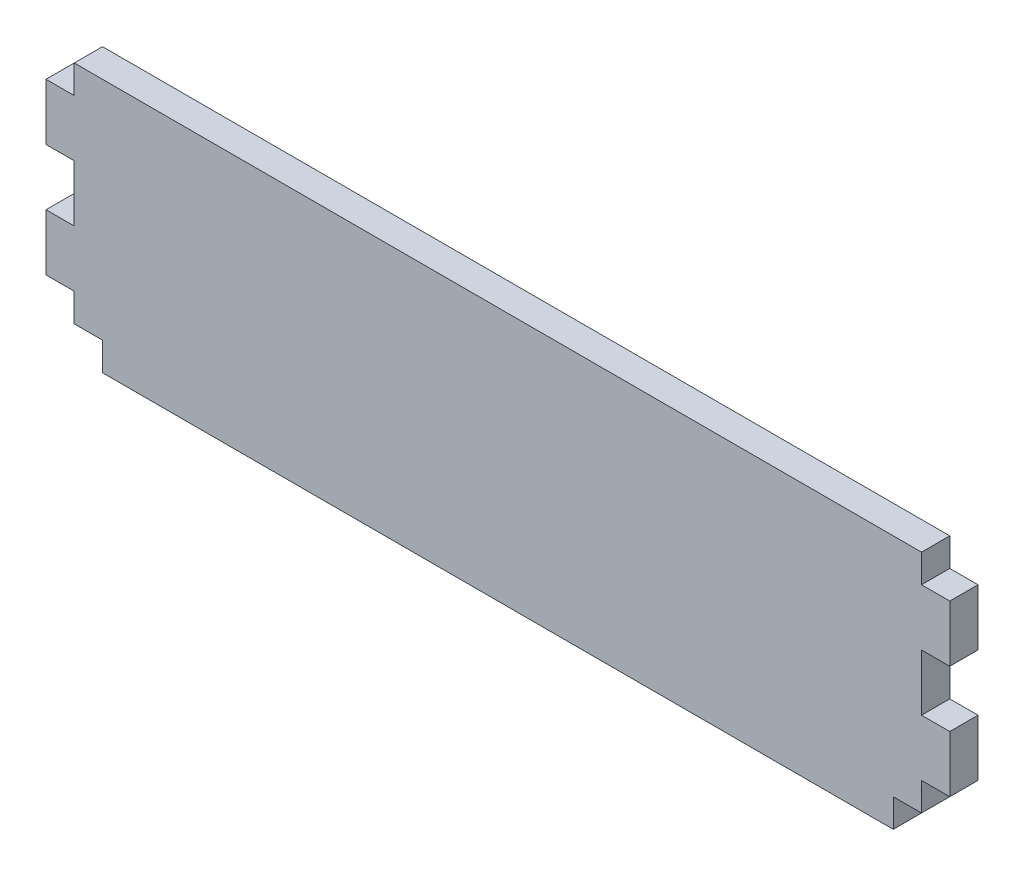
ISO-10303-21;
HEADER;
FILE_DESCRIPTION(('STEP AP214'),'2;1');
FILE_NAME('part.step','',(''),(''),'','','');
FILE_SCHEMA(('AUTOMOTIVE_DESIGN { 1 0 10303 214 1 1 1 1 }'));
ENDSEC;
DATA;
#1=APPLICATION_CONTEXT('core data for automotive mechanical design processes');
#2=APPLICATION_PROTOCOL_DEFINITION('international standard','automotive_design',2000,#1);
#3=PRODUCT_CONTEXT('',#1,'mechanical');
#4=PRODUCT('Part','Part','',(#3));
#5=PRODUCT_RELATED_PRODUCT_CATEGORY('part','',(#4));
#6=PRODUCT_DEFINITION_FORMATION('','',#4);
#7=PRODUCT_DEFINITION_CONTEXT('part definition',#1,'design');
#8=PRODUCT_DEFINITION('design','',#6,#7);
#9=PRODUCT_DEFINITION_SHAPE('','',#8);
#10=(LENGTH_UNIT() NAMED_UNIT(*) SI_UNIT(.MILLI.,.METRE.));
#11=(NAMED_UNIT(*) PLANE_ANGLE_UNIT() SI_UNIT($,.RADIAN.));
#12=(NAMED_UNIT(*) SI_UNIT($,.STERADIAN.) SOLID_ANGLE_UNIT());
#13=UNCERTAINTY_MEASURE_WITH_UNIT(LENGTH_MEASURE(1.E-05),#10,'distance_accuracy_value','');
#14=(GEOMETRIC_REPRESENTATION_CONTEXT(3) GLOBAL_UNCERTAINTY_ASSIGNED_CONTEXT((#13)) GLOBAL_UNIT_ASSIGNED_CONTEXT((#10,
#11,#12)) REPRESENTATION_CONTEXT('',''));
#15=CARTESIAN_POINT('',(0.,0.,0.));
#16=DIRECTION('',(0.,0.,1.));
#17=DIRECTION('',(1.,0.,0.));
#18=AXIS2_PLACEMENT_3D('',#15,#16,#17);
#19=CARTESIAN_POINT('',(85.5050137289704,-69.2237442922374,5.));
#20=DIRECTION('',(0.,1.,0.));
#21=DIRECTION('',(0.,0.,1.));
#22=AXIS2_PLACEMENT_3D('',#19,#20,#21);
#23=PLANE('',#22);
#24=DIRECTION('',(0.,0.,1.));
#25=VECTOR('',#24,1.);
#26=CARTESIAN_POINT('',(80.5050137289704,-69.2237442922374,0.));
#27=LINE('',#26,#25);
#28=CARTESIAN_POINT('',(80.5050137289704,-69.2237442922374,0.));
#29=VERTEX_POINT('',#28);
#30=CARTESIAN_POINT('',(80.5050137289704,-69.2237442922374,5.));
#31=VERTEX_POINT('',#30);
#32=EDGE_CURVE('E452',#29,#31,#27,.T.);
#33=ORIENTED_EDGE('',*,*,#32,.F.);
#34=DIRECTION('',(1.,0.,0.));
#35=VECTOR('',#34,1.);
#36=CARTESIAN_POINT('',(85.5050137289704,-69.2237442922374,0.));
#37=LINE('',#36,#35);
#38=CARTESIAN_POINT('',(85.5050137289704,-69.2237442922374,0.));
#39=VERTEX_POINT('',#38);
#40=EDGE_CURVE('E237',#29,#39,#37,.T.);
#41=ORIENTED_EDGE('',*,*,#40,.T.);
#42=DIRECTION('',(0.,0.,-1.));
#43=VECTOR('',#42,1.);
#44=CARTESIAN_POINT('',(85.5050137289704,-69.2237442922374,5.));
#45=LINE('',#44,#43);
#46=CARTESIAN_POINT('',(85.5050137289704,-69.2237442922374,5.));
#47=VERTEX_POINT('',#46);
#48=EDGE_CURVE('E11',#47,#39,#45,.T.);
#49=ORIENTED_EDGE('',*,*,#48,.F.);
#50=DIRECTION('',(1.,0.,0.));
#51=VECTOR('',#50,1.);
#52=CARTESIAN_POINT('',(85.5050137289704,-69.2237442922374,5.));
#53=LINE('',#52,#51);
#54=EDGE_CURVE('E147',#31,#47,#53,.T.);
#55=ORIENTED_EDGE('',*,*,#54,.F.);
#56=EDGE_LOOP('',(#33,#41,#49,#55));
#57=FACE_BOUND('',#56,.T.);
#58=ADVANCED_FACE('F45',(#57),#23,.F.);
#59=CARTESIAN_POINT('',(-64.4949862710296,-69.2237442922374,0.));
#60=VERTEX_POINT('',#59);
#61=CARTESIAN_POINT('',(-59.4949862710296,-69.2237442922374,0.));
#62=VERTEX_POINT('',#61);
#63=EDGE_CURVE('E232',#60,#62,#37,.T.);
#64=ORIENTED_EDGE('',*,*,#63,.T.);
#65=DIRECTION('',(0.,0.,1.));
#66=VECTOR('',#65,1.);
#67=CARTESIAN_POINT('',(-59.4949862710296,-69.2237442922374,0.));
#68=LINE('',#67,#66);
#69=CARTESIAN_POINT('',(-59.4949862710296,-69.2237442922374,5.));
#70=VERTEX_POINT('',#69);
#71=EDGE_CURVE('E435',#62,#70,#68,.T.);
#72=ORIENTED_EDGE('',*,*,#71,.T.);
#73=CARTESIAN_POINT('',(-64.4949862710296,-69.2237442922374,5.));
#74=VERTEX_POINT('',#73);
#75=EDGE_CURVE('E434',#74,#70,#53,.T.);
#76=ORIENTED_EDGE('',*,*,#75,.F.);
#77=DIRECTION('',(0.,0.,-1.));
#78=VECTOR('',#77,1.);
#79=CARTESIAN_POINT('',(-64.4949862710296,-69.2237442922374,5.));
#80=LINE('',#79,#78);
#81=EDGE_CURVE('E228',#74,#60,#80,.T.);
#82=ORIENTED_EDGE('',*,*,#81,.T.);
#83=EDGE_LOOP('',(#64,#72,#76,#82));
#84=FACE_BOUND('',#83,.T.);
#85=ADVANCED_FACE('F47',(#84),#23,.F.);
#86=CARTESIAN_POINT('',(85.5050137289704,-64.2237442922374,5.));
#87=DIRECTION('',(-1.,0.,0.));
#88=DIRECTION('',(0.,0.,1.));
#89=AXIS2_PLACEMENT_3D('',#86,#87,#88);
#90=PLANE('',#89);
#91=DIRECTION('',(0.,1.,0.));
#92=VECTOR('',#91,1.);
#93=CARTESIAN_POINT('',(85.5050137289704,-64.2237442922374,0.));
#94=LINE('',#93,#92);
#95=CARTESIAN_POINT('',(85.5050137289704,-64.2237442922374,0.));
#96=VERTEX_POINT('',#95);
#97=EDGE_CURVE('E236',#39,#96,#94,.T.);
#98=ORIENTED_EDGE('',*,*,#97,.T.);
#99=DIRECTION('',(0.,0.,-1.));
#100=VECTOR('',#99,1.);
#101=CARTESIAN_POINT('',(85.5050137289704,-64.2237442922374,5.));
#102=LINE('',#101,#100);
#103=CARTESIAN_POINT('',(85.5050137289704,-64.2237442922374,5.));
#104=VERTEX_POINT('',#103);
#105=EDGE_CURVE('E54',#104,#96,#102,.T.);
#106=ORIENTED_EDGE('',*,*,#105,.F.);
#107=DIRECTION('',(0.,1.,0.));
#108=VECTOR('',#107,1.);
#109=CARTESIAN_POINT('',(85.5050137289704,-64.2237442922374,5.));
#110=LINE('',#109,#108);
#111=EDGE_CURVE('E437',#47,#104,#110,.T.);
#112=ORIENTED_EDGE('',*,*,#111,.F.);
#113=ORIENTED_EDGE('',*,*,#48,.T.);
#114=EDGE_LOOP('',(#98,#106,#112,#113));
#115=FACE_BOUND('',#114,.T.);
#116=ADVANCED_FACE('F447',(#115),#90,.F.);
#117=CARTESIAN_POINT('',(90.5050137289704,-64.2237442922374,5.));
#118=DIRECTION('',(0.,1.,0.));
#119=DIRECTION('',(0.,0.,1.));
#120=AXIS2_PLACEMENT_3D('',#117,#118,#119);
#121=PLANE('',#120);
#122=DIRECTION('',(1.,0.,0.));
#123=VECTOR('',#122,1.);
#124=CARTESIAN_POINT('',(90.5050137289704,-64.2237442922374,0.));
#125=LINE('',#124,#123);
#126=CARTESIAN_POINT('',(90.5050137289704,-64.2237442922374,0.));
#127=VERTEX_POINT('',#126);
#128=EDGE_CURVE('E240',#96,#127,#125,.T.);
#129=ORIENTED_EDGE('',*,*,#128,.T.);
#130=DIRECTION('',(0.,0.,-1.));
#131=VECTOR('',#130,1.);
#132=CARTESIAN_POINT('',(90.5050137289704,-64.2237442922374,5.));
#133=LINE('',#132,#131);
#134=CARTESIAN_POINT('',(90.5050137289704,-64.2237442922374,5.));
#135=VERTEX_POINT('',#134);
#136=EDGE_CURVE('E350',#135,#127,#133,.T.);
#137=ORIENTED_EDGE('',*,*,#136,.F.);
#138=DIRECTION('',(1.,0.,0.));
#139=VECTOR('',#138,1.);
#140=CARTESIAN_POINT('',(90.5050137289704,-64.2237442922374,5.));
#141=LINE('',#140,#139);
#142=EDGE_CURVE('E361',#104,#135,#141,.T.);
#143=ORIENTED_EDGE('',*,*,#142,.F.);
#144=ORIENTED_EDGE('',*,*,#105,.T.);
#145=EDGE_LOOP('',(#129,#137,#143,#144));
#146=FACE_BOUND('',#145,.T.);
#147=ADVANCED_FACE('F359',(#146),#121,.F.);
#148=CARTESIAN_POINT('',(90.5050137289704,-54.2237442922374,5.));
#149=DIRECTION('',(-1.,0.,0.));
#150=DIRECTION('',(0.,0.,1.));
#151=AXIS2_PLACEMENT_3D('',#148,#149,#150);
#152=PLANE('',#151);
#153=DIRECTION('',(0.,1.,0.));
#154=VECTOR('',#153,1.);
#155=CARTESIAN_POINT('',(90.5050137289704,-54.2237442922374,0.));
#156=LINE('',#155,#154);
#157=CARTESIAN_POINT('',(90.5050137289704,-54.2237442922374,0.));
#158=VERTEX_POINT('',#157);
#159=EDGE_CURVE('E243',#127,#158,#156,.T.);
#160=ORIENTED_EDGE('',*,*,#159,.T.);
#161=DIRECTION('',(0.,0.,-1.));
#162=VECTOR('',#161,1.);
#163=CARTESIAN_POINT('',(90.5050137289704,-54.2237442922374,5.));
#164=LINE('',#163,#162);
#165=CARTESIAN_POINT('',(90.5050137289704,-54.2237442922374,5.));
#166=VERTEX_POINT('',#165);
#167=EDGE_CURVE('E346',#166,#158,#164,.T.);
#168=ORIENTED_EDGE('',*,*,#167,.F.);
#169=DIRECTION('',(0.,1.,0.));
#170=VECTOR('',#169,1.);
#171=CARTESIAN_POINT('',(90.5050137289704,-54.2237442922374,5.));
#172=LINE('',#171,#170);
#173=EDGE_CURVE('E383',#135,#166,#172,.T.);
#174=ORIENTED_EDGE('',*,*,#173,.F.);
#175=ORIENTED_EDGE('',*,*,#136,.T.);
#176=EDGE_LOOP('',(#160,#168,#174,#175));
#177=FACE_BOUND('',#176,.T.);
#178=ADVANCED_FACE('F373',(#177),#152,.F.);
#179=CARTESIAN_POINT('',(90.5050137289704,-54.2237442922374,5.));
#180=DIRECTION('',(0.,-1.,0.));
#181=DIRECTION('',(0.,0.,-1.));
#182=AXIS2_PLACEMENT_3D('',#179,#180,#181);
#183=PLANE('',#182);
#184=DIRECTION('',(-1.,0.,0.));
#185=VECTOR('',#184,1.);
#186=CARTESIAN_POINT('',(90.5050137289704,-54.2237442922374,0.));
#187=LINE('',#186,#185);
#188=CARTESIAN_POINT('',(85.5050137289704,-54.2237442922374,0.));
#189=VERTEX_POINT('',#188);
#190=EDGE_CURVE('E246',#158,#189,#187,.T.);
#191=ORIENTED_EDGE('',*,*,#190,.T.);
#192=DIRECTION('',(0.,0.,-1.));
#193=VECTOR('',#192,1.);
#194=CARTESIAN_POINT('',(85.5050137289704,-54.2237442922374,5.));
#195=LINE('',#194,#193);
#196=CARTESIAN_POINT('',(85.5050137289704,-54.2237442922374,5.));
#197=VERTEX_POINT('',#196);
#198=EDGE_CURVE('E342',#197,#189,#195,.T.);
#199=ORIENTED_EDGE('',*,*,#198,.F.);
#200=DIRECTION('',(-1.,0.,0.));
#201=VECTOR('',#200,1.);
#202=CARTESIAN_POINT('',(90.5050137289704,-54.2237442922374,5.));
#203=LINE('',#202,#201);
#204=EDGE_CURVE('E379',#166,#197,#203,.T.);
#205=ORIENTED_EDGE('',*,*,#204,.F.);
#206=ORIENTED_EDGE('',*,*,#167,.T.);
#207=EDGE_LOOP('',(#191,#199,#205,#206));
#208=FACE_BOUND('',#207,.T.);
#209=ADVANCED_FACE('F377',(#208),#183,.F.);
#210=CARTESIAN_POINT('',(85.5050137289704,-54.2237442922374,5.));
#211=DIRECTION('',(-1.,0.,0.));
#212=DIRECTION('',(0.,-1.,0.));
#213=AXIS2_PLACEMENT_3D('',#210,#211,#212);
#214=PLANE('',#213);
#215=DIRECTION('',(0.,1.,0.));
#216=VECTOR('',#215,1.);
#217=CARTESIAN_POINT('',(85.5050137289704,-54.2237442922374,0.));
#218=LINE('',#217,#216);
#219=CARTESIAN_POINT('',(85.5050137289704,-44.2237442922374,0.));
#220=VERTEX_POINT('',#219);
#221=EDGE_CURVE('E249',#189,#220,#218,.T.);
#222=ORIENTED_EDGE('',*,*,#221,.T.);
#223=DIRECTION('',(0.,0.,-1.));
#224=VECTOR('',#223,1.);
#225=CARTESIAN_POINT('',(85.5050137289704,-44.2237442922374,5.));
#226=LINE('',#225,#224);
#227=CARTESIAN_POINT('',(85.5050137289704,-44.2237442922374,5.));
#228=VERTEX_POINT('',#227);
#229=EDGE_CURVE('E338',#228,#220,#226,.T.);
#230=ORIENTED_EDGE('',*,*,#229,.F.);
#231=DIRECTION('',(0.,1.,0.));
#232=VECTOR('',#231,1.);
#233=CARTESIAN_POINT('',(85.5050137289704,-54.2237442922374,5.));
#234=LINE('',#233,#232);
#235=EDGE_CURVE('E382',#197,#228,#234,.T.);
#236=ORIENTED_EDGE('',*,*,#235,.F.);
#237=ORIENTED_EDGE('',*,*,#198,.T.);
#238=EDGE_LOOP('',(#222,#230,#236,#237));
#239=FACE_BOUND('',#238,.T.);
#240=ADVANCED_FACE('F529',(#239),#214,.F.);
#241=CARTESIAN_POINT('',(90.5050137289704,-44.2237442922374,5.));
#242=DIRECTION('',(0.,1.,0.));
#243=DIRECTION('',(0.,0.,1.));
#244=AXIS2_PLACEMENT_3D('',#241,#242,#243);
#245=PLANE('',#244);
#246=DIRECTION('',(1.,0.,0.));
#247=VECTOR('',#246,1.);
#248=CARTESIAN_POINT('',(90.5050137289704,-44.2237442922374,0.));
#249=LINE('',#248,#247);
#250=CARTESIAN_POINT('',(90.5050137289704,-44.2237442922374,0.));
#251=VERTEX_POINT('',#250);
#252=EDGE_CURVE('E252',#220,#251,#249,.T.);
#253=ORIENTED_EDGE('',*,*,#252,.T.);
#254=DIRECTION('',(0.,0.,-1.));
#255=VECTOR('',#254,1.);
#256=CARTESIAN_POINT('',(90.5050137289704,-44.2237442922374,5.));
#257=LINE('',#256,#255);
#258=CARTESIAN_POINT('',(90.5050137289704,-44.2237442922374,5.));
#259=VERTEX_POINT('',#258);
#260=EDGE_CURVE('E334',#259,#251,#257,.T.);
#261=ORIENTED_EDGE('',*,*,#260,.F.);
#262=DIRECTION('',(1.,0.,0.));
#263=VECTOR('',#262,1.);
#264=CARTESIAN_POINT('',(90.5050137289704,-44.2237442922374,5.));
#265=LINE('',#264,#263);
#266=EDGE_CURVE('E387',#228,#259,#265,.T.);
#267=ORIENTED_EDGE('',*,*,#266,.F.);
#268=ORIENTED_EDGE('',*,*,#229,.T.);
#269=EDGE_LOOP('',(#253,#261,#267,#268));
#270=FACE_BOUND('',#269,.T.);
#271=ADVANCED_FACE('F532',(#270),#245,.F.);
#272=CARTESIAN_POINT('',(90.5050137289704,-34.2237442922374,5.));
#273=DIRECTION('',(-1.,0.,0.));
#274=DIRECTION('',(0.,0.,1.));
#275=AXIS2_PLACEMENT_3D('',#272,#273,#274);
#276=PLANE('',#275);
#277=DIRECTION('',(0.,1.,0.));
#278=VECTOR('',#277,1.);
#279=CARTESIAN_POINT('',(90.5050137289704,-34.2237442922374,0.));
#280=LINE('',#279,#278);
#281=CARTESIAN_POINT('',(90.5050137289704,-34.2237442922374,0.));
#282=VERTEX_POINT('',#281);
#283=EDGE_CURVE('E255',#251,#282,#280,.T.);
#284=ORIENTED_EDGE('',*,*,#283,.T.);
#285=DIRECTION('',(0.,0.,-1.));
#286=VECTOR('',#285,1.);
#287=CARTESIAN_POINT('',(90.5050137289704,-34.2237442922374,5.));
#288=LINE('',#287,#286);
#289=CARTESIAN_POINT('',(90.5050137289704,-34.2237442922374,5.));
#290=VERTEX_POINT('',#289);
#291=EDGE_CURVE('E330',#290,#282,#288,.T.);
#292=ORIENTED_EDGE('',*,*,#291,.F.);
#293=DIRECTION('',(0.,1.,0.));
#294=VECTOR('',#293,1.);
#295=CARTESIAN_POINT('',(90.5050137289704,-34.2237442922374,5.));
#296=LINE('',#295,#294);
#297=EDGE_CURVE('E394',#259,#290,#296,.T.);
#298=ORIENTED_EDGE('',*,*,#297,.F.);
#299=ORIENTED_EDGE('',*,*,#260,.T.);
#300=EDGE_LOOP('',(#284,#292,#298,#299));
#301=FACE_BOUND('',#300,.T.);
#302=ADVANCED_FACE('F536',(#301),#276,.F.);
#303=CARTESIAN_POINT('',(90.5050137289704,-34.2237442922374,5.));
#304=DIRECTION('',(0.,-1.,0.));
#305=DIRECTION('',(0.,0.,-1.));
#306=AXIS2_PLACEMENT_3D('',#303,#304,#305);
#307=PLANE('',#306);
#308=DIRECTION('',(-1.,0.,0.));
#309=VECTOR('',#308,1.);
#310=CARTESIAN_POINT('',(90.5050137289704,-34.2237442922374,0.));
#311=LINE('',#310,#309);
#312=CARTESIAN_POINT('',(85.5050137289704,-34.2237442922374,0.));
#313=VERTEX_POINT('',#312);
#314=EDGE_CURVE('E258',#282,#313,#311,.T.);
#315=ORIENTED_EDGE('',*,*,#314,.T.);
#316=DIRECTION('',(0.,0.,-1.));
#317=VECTOR('',#316,1.);
#318=CARTESIAN_POINT('',(85.5050137289704,-34.2237442922374,5.));
#319=LINE('',#318,#317);
#320=CARTESIAN_POINT('',(85.5050137289704,-34.2237442922374,5.));
#321=VERTEX_POINT('',#320);
#322=EDGE_CURVE('E326',#321,#313,#319,.T.);
#323=ORIENTED_EDGE('',*,*,#322,.F.);
#324=DIRECTION('',(-1.,0.,0.));
#325=VECTOR('',#324,1.);
#326=CARTESIAN_POINT('',(90.5050137289704,-34.2237442922374,5.));
#327=LINE('',#326,#325);
#328=EDGE_CURVE('E397',#290,#321,#327,.T.);
#329=ORIENTED_EDGE('',*,*,#328,.F.);
#330=ORIENTED_EDGE('',*,*,#291,.T.);
#331=EDGE_LOOP('',(#315,#323,#329,#330));
#332=FACE_BOUND('',#331,.T.);
#333=ADVANCED_FACE('F540',(#332),#307,.F.);
#334=CARTESIAN_POINT('',(85.5050137289704,-34.2237442922374,5.));
#335=DIRECTION('',(-1.,0.,0.));
#336=DIRECTION('',(0.,-1.,0.));
#337=AXIS2_PLACEMENT_3D('',#334,#335,#336);
#338=PLANE('',#337);
#339=DIRECTION('',(0.,1.,0.));
#340=VECTOR('',#339,1.);
#341=CARTESIAN_POINT('',(85.5050137289704,-34.2237442922374,0.));
#342=LINE('',#341,#340);
#343=CARTESIAN_POINT('',(85.5050137289703,-29.2237442922375,0.));
#344=VERTEX_POINT('',#343);
#345=EDGE_CURVE('E261',#313,#344,#342,.T.);
#346=ORIENTED_EDGE('',*,*,#345,.T.);
#347=DIRECTION('',(0.,0.,-1.));
#348=VECTOR('',#347,1.);
#349=CARTESIAN_POINT('',(85.5050137289703,-29.2237442922375,5.));
#350=LINE('',#349,#348);
#351=CARTESIAN_POINT('',(85.5050137289703,-29.2237442922375,5.));
#352=VERTEX_POINT('',#351);
#353=EDGE_CURVE('E322',#352,#344,#350,.T.);
#354=ORIENTED_EDGE('',*,*,#353,.F.);
#355=DIRECTION('',(0.,1.,0.));
#356=VECTOR('',#355,1.);
#357=CARTESIAN_POINT('',(85.5050137289704,-34.2237442922374,5.));
#358=LINE('',#357,#356);
#359=EDGE_CURVE('E400',#321,#352,#358,.T.);
#360=ORIENTED_EDGE('',*,*,#359,.F.);
#361=ORIENTED_EDGE('',*,*,#322,.T.);
#362=EDGE_LOOP('',(#346,#354,#360,#361));
#363=FACE_BOUND('',#362,.T.);
#364=ADVANCED_FACE('F544',(#363),#338,.F.);
#365=CARTESIAN_POINT('',(-64.4949862710296,-29.2237442922375,5.));
#366=DIRECTION('',(0.,-1.,0.));
#367=DIRECTION('',(0.,0.,-1.));
#368=AXIS2_PLACEMENT_3D('',#365,#366,#367);
#369=PLANE('',#368);
#370=DIRECTION('',(-1.,0.,0.));
#371=VECTOR('',#370,1.);
#372=CARTESIAN_POINT('',(-64.4949862710296,-29.2237442922375,0.));
#373=LINE('',#372,#371);
#374=CARTESIAN_POINT('',(-64.4949862710296,-29.2237442922375,0.));
#375=VERTEX_POINT('',#374);
#376=EDGE_CURVE('E264',#344,#375,#373,.T.);
#377=ORIENTED_EDGE('',*,*,#376,.T.);
#378=DIRECTION('',(0.,0.,-1.));
#379=VECTOR('',#378,1.);
#380=CARTESIAN_POINT('',(-64.4949862710296,-29.2237442922375,5.));
#381=LINE('',#380,#379);
#382=CARTESIAN_POINT('',(-64.4949862710296,-29.2237442922375,5.));
#383=VERTEX_POINT('',#382);
#384=EDGE_CURVE('E318',#383,#375,#381,.T.);
#385=ORIENTED_EDGE('',*,*,#384,.F.);
#386=DIRECTION('',(-1.,0.,0.));
#387=VECTOR('',#386,1.);
#388=CARTESIAN_POINT('',(-64.4949862710296,-29.2237442922375,5.));
#389=LINE('',#388,#387);
#390=EDGE_CURVE('E403',#352,#383,#389,.T.);
#391=ORIENTED_EDGE('',*,*,#390,.F.);
#392=ORIENTED_EDGE('',*,*,#353,.T.);
#393=EDGE_LOOP('',(#377,#385,#391,#392));
#394=FACE_BOUND('',#393,.T.);
#395=ADVANCED_FACE('F548',(#394),#369,.F.);
#396=CARTESIAN_POINT('',(-64.4949862710296,-34.2237442922374,5.));
#397=DIRECTION('',(1.,0.,0.));
#398=DIRECTION('',(0.,0.,-1.));
#399=AXIS2_PLACEMENT_3D('',#396,#397,#398);
#400=PLANE('',#399);
#401=DIRECTION('',(0.,-1.,0.));
#402=VECTOR('',#401,1.);
#403=CARTESIAN_POINT('',(-64.4949862710296,-34.2237442922374,0.));
#404=LINE('',#403,#402);
#405=CARTESIAN_POINT('',(-64.4949862710296,-34.2237442922374,0.));
#406=VERTEX_POINT('',#405);
#407=EDGE_CURVE('E267',#375,#406,#404,.T.);
#408=ORIENTED_EDGE('',*,*,#407,.T.);
#409=DIRECTION('',(0.,0.,-1.));
#410=VECTOR('',#409,1.);
#411=CARTESIAN_POINT('',(-64.4949862710296,-34.2237442922374,5.));
#412=LINE('',#411,#410);
#413=CARTESIAN_POINT('',(-64.4949862710296,-34.2237442922374,5.));
#414=VERTEX_POINT('',#413);
#415=EDGE_CURVE('E314',#414,#406,#412,.T.);
#416=ORIENTED_EDGE('',*,*,#415,.F.);
#417=DIRECTION('',(0.,-1.,0.));
#418=VECTOR('',#417,1.);
#419=CARTESIAN_POINT('',(-64.4949862710296,-34.2237442922374,5.));
#420=LINE('',#419,#418);
#421=EDGE_CURVE('E406',#383,#414,#420,.T.);
#422=ORIENTED_EDGE('',*,*,#421,.F.);
#423=ORIENTED_EDGE('',*,*,#384,.T.);
#424=EDGE_LOOP('',(#408,#416,#422,#423));
#425=FACE_BOUND('',#424,.T.);
#426=ADVANCED_FACE('F552',(#425),#400,.F.);
#427=CARTESIAN_POINT('',(-69.4949862710296,-34.2237442922374,5.));
#428=DIRECTION('',(0.,-1.,0.));
#429=DIRECTION('',(0.,0.,-1.));
#430=AXIS2_PLACEMENT_3D('',#427,#428,#429);
#431=PLANE('',#430);
#432=DIRECTION('',(-1.,0.,0.));
#433=VECTOR('',#432,1.);
#434=CARTESIAN_POINT('',(-69.4949862710296,-34.2237442922374,0.));
#435=LINE('',#434,#433);
#436=CARTESIAN_POINT('',(-69.4949862710296,-34.2237442922374,0.));
#437=VERTEX_POINT('',#436);
#438=EDGE_CURVE('E270',#406,#437,#435,.T.);
#439=ORIENTED_EDGE('',*,*,#438,.T.);
#440=DIRECTION('',(0.,0.,-1.));
#441=VECTOR('',#440,1.);
#442=CARTESIAN_POINT('',(-69.4949862710296,-34.2237442922374,5.));
#443=LINE('',#442,#441);
#444=CARTESIAN_POINT('',(-69.4949862710296,-34.2237442922374,5.));
#445=VERTEX_POINT('',#444);
#446=EDGE_CURVE('E310',#445,#437,#443,.T.);
#447=ORIENTED_EDGE('',*,*,#446,.F.);
#448=DIRECTION('',(-1.,0.,0.));
#449=VECTOR('',#448,1.);
#450=CARTESIAN_POINT('',(-69.4949862710296,-34.2237442922374,5.));
#451=LINE('',#450,#449);
#452=EDGE_CURVE('E409',#414,#445,#451,.T.);
#453=ORIENTED_EDGE('',*,*,#452,.F.);
#454=ORIENTED_EDGE('',*,*,#415,.T.);
#455=EDGE_LOOP('',(#439,#447,#453,#454));
#456=FACE_BOUND('',#455,.T.);
#457=ADVANCED_FACE('F556',(#456),#431,.F.);
#458=CARTESIAN_POINT('',(-69.4949862710296,-34.2237442922374,5.));
#459=DIRECTION('',(1.,0.,0.));
#460=DIRECTION('',(0.,0.,-1.));
#461=AXIS2_PLACEMENT_3D('',#458,#459,#460);
#462=PLANE('',#461);
#463=DIRECTION('',(0.,-1.,0.));
#464=VECTOR('',#463,1.);
#465=CARTESIAN_POINT('',(-69.4949862710296,-34.2237442922374,0.));
#466=LINE('',#465,#464);
#467=CARTESIAN_POINT('',(-69.4949862710296,-44.2237442922374,0.));
#468=VERTEX_POINT('',#467);
#469=EDGE_CURVE('E273',#437,#468,#466,.T.);
#470=ORIENTED_EDGE('',*,*,#469,.T.);
#471=DIRECTION('',(0.,0.,-1.));
#472=VECTOR('',#471,1.);
#473=CARTESIAN_POINT('',(-69.4949862710296,-44.2237442922374,5.));
#474=LINE('',#473,#472);
#475=CARTESIAN_POINT('',(-69.4949862710296,-44.2237442922374,5.));
#476=VERTEX_POINT('',#475);
#477=EDGE_CURVE('E306',#476,#468,#474,.T.);
#478=ORIENTED_EDGE('',*,*,#477,.F.);
#479=DIRECTION('',(0.,-1.,0.));
#480=VECTOR('',#479,1.);
#481=CARTESIAN_POINT('',(-69.4949862710296,-34.2237442922374,5.));
#482=LINE('',#481,#480);
#483=EDGE_CURVE('E412',#445,#476,#482,.T.);
#484=ORIENTED_EDGE('',*,*,#483,.F.);
#485=ORIENTED_EDGE('',*,*,#446,.T.);
#486=EDGE_LOOP('',(#470,#478,#484,#485));
#487=FACE_BOUND('',#486,.T.);
#488=ADVANCED_FACE('F560',(#487),#462,.F.);
#489=CARTESIAN_POINT('',(-69.4949862710296,-44.2237442922374,5.));
#490=DIRECTION('',(0.,1.,0.));
#491=DIRECTION('',(0.,0.,1.));
#492=AXIS2_PLACEMENT_3D('',#489,#490,#491);
#493=PLANE('',#492);
#494=DIRECTION('',(1.,0.,0.));
#495=VECTOR('',#494,1.);
#496=CARTESIAN_POINT('',(-69.4949862710296,-44.2237442922374,0.));
#497=LINE('',#496,#495);
#498=CARTESIAN_POINT('',(-64.4949862710296,-44.2237442922374,0.));
#499=VERTEX_POINT('',#498);
#500=EDGE_CURVE('E276',#468,#499,#497,.T.);
#501=ORIENTED_EDGE('',*,*,#500,.T.);
#502=DIRECTION('',(0.,0.,-1.));
#503=VECTOR('',#502,1.);
#504=CARTESIAN_POINT('',(-64.4949862710296,-44.2237442922374,5.));
#505=LINE('',#504,#503);
#506=CARTESIAN_POINT('',(-64.4949862710296,-44.2237442922374,5.));
#507=VERTEX_POINT('',#506);
#508=EDGE_CURVE('E302',#507,#499,#505,.T.);
#509=ORIENTED_EDGE('',*,*,#508,.F.);
#510=DIRECTION('',(1.,0.,0.));
#511=VECTOR('',#510,1.);
#512=CARTESIAN_POINT('',(-69.4949862710296,-44.2237442922374,5.));
#513=LINE('',#512,#511);
#514=EDGE_CURVE('E415',#476,#507,#513,.T.);
#515=ORIENTED_EDGE('',*,*,#514,.F.);
#516=ORIENTED_EDGE('',*,*,#477,.T.);
#517=EDGE_LOOP('',(#501,#509,#515,#516));
#518=FACE_BOUND('',#517,.T.);
#519=ADVANCED_FACE('F564',(#518),#493,.F.);
#520=CARTESIAN_POINT('',(-64.4949862710296,-54.2237442922374,5.));
#521=DIRECTION('',(1.,0.,0.));
#522=DIRECTION('',(0.,0.,-1.));
#523=AXIS2_PLACEMENT_3D('',#520,#521,#522);
#524=PLANE('',#523);
#525=DIRECTION('',(0.,-1.,0.));
#526=VECTOR('',#525,1.);
#527=CARTESIAN_POINT('',(-64.4949862710296,-54.2237442922374,0.));
#528=LINE('',#527,#526);
#529=CARTESIAN_POINT('',(-64.4949862710296,-54.2237442922374,0.));
#530=VERTEX_POINT('',#529);
#531=EDGE_CURVE('E279',#499,#530,#528,.T.);
#532=ORIENTED_EDGE('',*,*,#531,.T.);
#533=DIRECTION('',(0.,0.,-1.));
#534=VECTOR('',#533,1.);
#535=CARTESIAN_POINT('',(-64.4949862710296,-54.2237442922374,5.));
#536=LINE('',#535,#534);
#537=CARTESIAN_POINT('',(-64.4949862710296,-54.2237442922374,5.));
#538=VERTEX_POINT('',#537);
#539=EDGE_CURVE('E298',#538,#530,#536,.T.);
#540=ORIENTED_EDGE('',*,*,#539,.F.);
#541=DIRECTION('',(0.,-1.,0.));
#542=VECTOR('',#541,1.);
#543=CARTESIAN_POINT('',(-64.4949862710296,-54.2237442922374,5.));
#544=LINE('',#543,#542);
#545=EDGE_CURVE('E418',#507,#538,#544,.T.);
#546=ORIENTED_EDGE('',*,*,#545,.F.);
#547=ORIENTED_EDGE('',*,*,#508,.T.);
#548=EDGE_LOOP('',(#532,#540,#546,#547));
#549=FACE_BOUND('',#548,.T.);
#550=ADVANCED_FACE('F426',(#549),#524,.F.);
#551=CARTESIAN_POINT('',(-69.4949862710296,-54.2237442922374,5.));
#552=DIRECTION('',(0.,-1.,0.));
#553=DIRECTION('',(0.,0.,-1.));
#554=AXIS2_PLACEMENT_3D('',#551,#552,#553);
#555=PLANE('',#554);
#556=DIRECTION('',(-1.,0.,0.));
#557=VECTOR('',#556,1.);
#558=CARTESIAN_POINT('',(-69.4949862710296,-54.2237442922374,0.));
#559=LINE('',#558,#557);
#560=CARTESIAN_POINT('',(-69.4949862710296,-54.2237442922374,0.));
#561=VERTEX_POINT('',#560);
#562=EDGE_CURVE('E282',#530,#561,#559,.T.);
#563=ORIENTED_EDGE('',*,*,#562,.T.);
#564=DIRECTION('',(0.,0.,-1.));
#565=VECTOR('',#564,1.);
#566=CARTESIAN_POINT('',(-69.4949862710296,-54.2237442922374,5.));
#567=LINE('',#566,#565);
#568=CARTESIAN_POINT('',(-69.4949862710296,-54.2237442922374,5.));
#569=VERTEX_POINT('',#568);
#570=EDGE_CURVE('E221',#569,#561,#567,.T.);
#571=ORIENTED_EDGE('',*,*,#570,.F.);
#572=DIRECTION('',(-1.,0.,0.));
#573=VECTOR('',#572,1.);
#574=CARTESIAN_POINT('',(-69.4949862710296,-54.2237442922374,5.));
#575=LINE('',#574,#573);
#576=EDGE_CURVE('E207',#538,#569,#575,.T.);
#577=ORIENTED_EDGE('',*,*,#576,.F.);
#578=ORIENTED_EDGE('',*,*,#539,.T.);
#579=EDGE_LOOP('',(#563,#571,#577,#578));
#580=FACE_BOUND('',#579,.T.);
#581=ADVANCED_FACE('F430',(#580),#555,.F.);
#582=CARTESIAN_POINT('',(-69.4949862710296,-54.2237442922374,5.));
#583=DIRECTION('',(1.,0.,0.));
#584=DIRECTION('',(0.,0.,-1.));
#585=AXIS2_PLACEMENT_3D('',#582,#583,#584);
#586=PLANE('',#585);
#587=DIRECTION('',(0.,-1.,0.));
#588=VECTOR('',#587,1.);
#589=CARTESIAN_POINT('',(-69.4949862710296,-54.2237442922374,0.));
#590=LINE('',#589,#588);
#591=CARTESIAN_POINT('',(-69.4949862710296,-64.2237442922374,0.));
#592=VERTEX_POINT('',#591);
#593=EDGE_CURVE('E217',#561,#592,#590,.T.);
#594=ORIENTED_EDGE('',*,*,#593,.T.);
#595=DIRECTION('',(0.,0.,-1.));
#596=VECTOR('',#595,1.);
#597=CARTESIAN_POINT('',(-69.4949862710296,-64.2237442922374,5.));
#598=LINE('',#597,#596);
#599=CARTESIAN_POINT('',(-69.4949862710296,-64.2237442922374,5.));
#600=VERTEX_POINT('',#599);
#601=EDGE_CURVE('E214',#600,#592,#598,.T.);
#602=ORIENTED_EDGE('',*,*,#601,.F.);
#603=DIRECTION('',(0.,-1.,0.));
#604=VECTOR('',#603,1.);
#605=CARTESIAN_POINT('',(-69.4949862710296,-54.2237442922374,5.));
#606=LINE('',#605,#604);
#607=EDGE_CURVE('E200',#569,#600,#606,.T.);
#608=ORIENTED_EDGE('',*,*,#607,.F.);
#609=ORIENTED_EDGE('',*,*,#570,.T.);
#610=EDGE_LOOP('',(#594,#602,#608,#609));
#611=FACE_BOUND('',#610,.T.);
#612=ADVANCED_FACE('F215',(#611),#586,.F.);
#613=CARTESIAN_POINT('',(-69.4949862710296,-64.2237442922374,5.));
#614=DIRECTION('',(0.,1.,0.));
#615=DIRECTION('',(0.,0.,1.));
#616=AXIS2_PLACEMENT_3D('',#613,#614,#615);
#617=PLANE('',#616);
#618=DIRECTION('',(1.,0.,0.));
#619=VECTOR('',#618,1.);
#620=CARTESIAN_POINT('',(-69.4949862710296,-64.2237442922374,0.));
#621=LINE('',#620,#619);
#622=CARTESIAN_POINT('',(-64.4949862710296,-64.2237442922374,0.));
#623=VERTEX_POINT('',#622);
#624=EDGE_CURVE('E287',#592,#623,#621,.T.);
#625=ORIENTED_EDGE('',*,*,#624,.T.);
#626=DIRECTION('',(0.,0.,-1.));
#627=VECTOR('',#626,1.);
#628=CARTESIAN_POINT('',(-64.4949862710296,-64.2237442922374,5.));
#629=LINE('',#628,#627);
#630=CARTESIAN_POINT('',(-64.4949862710296,-64.2237442922374,5.));
#631=VERTEX_POINT('',#630);
#632=EDGE_CURVE('E222',#631,#623,#629,.T.);
#633=ORIENTED_EDGE('',*,*,#632,.F.);
#634=DIRECTION('',(1.,0.,0.));
#635=VECTOR('',#634,1.);
#636=CARTESIAN_POINT('',(-69.4949862710296,-64.2237442922374,5.));
#637=LINE('',#636,#635);
#638=EDGE_CURVE('E204',#600,#631,#637,.T.);
#639=ORIENTED_EDGE('',*,*,#638,.F.);
#640=ORIENTED_EDGE('',*,*,#601,.T.);
#641=EDGE_LOOP('',(#625,#633,#639,#640));
#642=FACE_BOUND('',#641,.T.);
#643=ADVANCED_FACE('F224',(#642),#617,.F.);
#644=CARTESIAN_POINT('',(-64.4949862710296,-64.2237442922374,5.));
#645=DIRECTION('',(1.,0.,0.));
#646=DIRECTION('',(0.,0.,-1.));
#647=AXIS2_PLACEMENT_3D('',#644,#645,#646);
#648=PLANE('',#647);
#649=DIRECTION('',(0.,-1.,0.));
#650=VECTOR('',#649,1.);
#651=CARTESIAN_POINT('',(-64.4949862710296,-64.2237442922374,0.));
#652=LINE('',#651,#650);
#653=EDGE_CURVE('E139',#623,#60,#652,.T.);
#654=ORIENTED_EDGE('',*,*,#653,.T.);
#655=ORIENTED_EDGE('',*,*,#81,.F.);
#656=DIRECTION('',(0.,-1.,0.));
#657=VECTOR('',#656,1.);
#658=CARTESIAN_POINT('',(-64.4949862710296,-64.2237442922374,5.));
#659=LINE('',#658,#657);
#660=EDGE_CURVE('E70',#631,#74,#659,.T.);
#661=ORIENTED_EDGE('',*,*,#660,.F.);
#662=ORIENTED_EDGE('',*,*,#632,.T.);
#663=EDGE_LOOP('',(#654,#655,#661,#662));
#664=FACE_BOUND('',#663,.T.);
#665=ADVANCED_FACE('F431',(#664),#648,.F.);
#666=CARTESIAN_POINT('',(0.,0.,5.));
#667=DIRECTION('',(0.,0.,1.));
#668=DIRECTION('',(1.,0.,0.));
#669=AXIS2_PLACEMENT_3D('',#666,#667,#668);
#670=PLANE('',#669);
#671=ORIENTED_EDGE('',*,*,#75,.T.);
#672=DIRECTION('',(0.,-1.,0.));
#673=VECTOR('',#672,1.);
#674=CARTESIAN_POINT('',(-59.4949862710296,-69.2237442922374,5.));
#675=LINE('',#674,#673);
#676=CARTESIAN_POINT('',(-59.4949862710296,-74.2237442922375,5.));
#677=VERTEX_POINT('',#676);
#678=EDGE_CURVE('E61',#70,#677,#675,.T.);
#679=ORIENTED_EDGE('',*,*,#678,.T.);
#680=DIRECTION('',(1.,0.,0.));
#681=VECTOR('',#680,1.);
#682=CARTESIAN_POINT('',(-59.4949862710296,-74.2237442922375,5.));
#683=LINE('',#682,#681);
#684=CARTESIAN_POINT('',(80.5050137289704,-74.2237442922375,5.));
#685=VERTEX_POINT('',#684);
#686=EDGE_CURVE('E487',#677,#685,#683,.T.);
#687=ORIENTED_EDGE('',*,*,#686,.T.);
#688=DIRECTION('',(0.,1.,0.));
#689=VECTOR('',#688,1.);
#690=CARTESIAN_POINT('',(80.5050137289704,-69.2237442922374,5.));
#691=LINE('',#690,#689);
#692=EDGE_CURVE('E461',#685,#31,#691,.T.);
#693=ORIENTED_EDGE('',*,*,#692,.T.);
#694=ORIENTED_EDGE('',*,*,#54,.T.);
#695=ORIENTED_EDGE('',*,*,#111,.T.);
#696=ORIENTED_EDGE('',*,*,#142,.T.);
#697=ORIENTED_EDGE('',*,*,#173,.T.);
#698=ORIENTED_EDGE('',*,*,#204,.T.);
#699=ORIENTED_EDGE('',*,*,#235,.T.);
#700=ORIENTED_EDGE('',*,*,#266,.T.);
#701=ORIENTED_EDGE('',*,*,#297,.T.);
#702=ORIENTED_EDGE('',*,*,#328,.T.);
#703=ORIENTED_EDGE('',*,*,#359,.T.);
#704=ORIENTED_EDGE('',*,*,#390,.T.);
#705=ORIENTED_EDGE('',*,*,#421,.T.);
#706=ORIENTED_EDGE('',*,*,#452,.T.);
#707=ORIENTED_EDGE('',*,*,#483,.T.);
#708=ORIENTED_EDGE('',*,*,#514,.T.);
#709=ORIENTED_EDGE('',*,*,#545,.T.);
#710=ORIENTED_EDGE('',*,*,#576,.T.);
#711=ORIENTED_EDGE('',*,*,#607,.T.);
#712=ORIENTED_EDGE('',*,*,#638,.T.);
#713=ORIENTED_EDGE('',*,*,#660,.T.);
#714=EDGE_LOOP('',(#671,#679,#687,#693,#694,#695,#696,#697,#698,#699,#700,#701,#702,#703,#704,
#705,#706,#707,#708,#709,#710,#711,#712,#713));
#715=FACE_BOUND('',#714,.T.);
#716=ADVANCED_FACE('F202',(#715),#670,.T.);
#717=CARTESIAN_POINT('',(0.,0.,0.));
#718=DIRECTION('',(0.,0.,1.));
#719=DIRECTION('',(1.,0.,0.));
#720=AXIS2_PLACEMENT_3D('',#717,#718,#719);
#721=PLANE('',#720);
#722=ORIENTED_EDGE('',*,*,#63,.F.);
#723=ORIENTED_EDGE('',*,*,#653,.F.);
#724=ORIENTED_EDGE('',*,*,#624,.F.);
#725=ORIENTED_EDGE('',*,*,#593,.F.);
#726=ORIENTED_EDGE('',*,*,#562,.F.);
#727=ORIENTED_EDGE('',*,*,#531,.F.);
#728=ORIENTED_EDGE('',*,*,#500,.F.);
#729=ORIENTED_EDGE('',*,*,#469,.F.);
#730=ORIENTED_EDGE('',*,*,#438,.F.);
#731=ORIENTED_EDGE('',*,*,#407,.F.);
#732=ORIENTED_EDGE('',*,*,#376,.F.);
#733=ORIENTED_EDGE('',*,*,#345,.F.);
#734=ORIENTED_EDGE('',*,*,#314,.F.);
#735=ORIENTED_EDGE('',*,*,#283,.F.);
#736=ORIENTED_EDGE('',*,*,#252,.F.);
#737=ORIENTED_EDGE('',*,*,#221,.F.);
#738=ORIENTED_EDGE('',*,*,#190,.F.);
#739=ORIENTED_EDGE('',*,*,#159,.F.);
#740=ORIENTED_EDGE('',*,*,#128,.F.);
#741=ORIENTED_EDGE('',*,*,#97,.F.);
#742=ORIENTED_EDGE('',*,*,#40,.F.);
#743=DIRECTION('',(0.,1.,0.));
#744=VECTOR('',#743,1.);
#745=CARTESIAN_POINT('',(80.5050137289704,-69.2237442922374,0.));
#746=LINE('',#745,#744);
#747=CARTESIAN_POINT('',(80.5050137289704,-74.2237442922375,0.));
#748=VERTEX_POINT('',#747);
#749=EDGE_CURVE('E472',#748,#29,#746,.T.);
#750=ORIENTED_EDGE('',*,*,#749,.F.);
#751=DIRECTION('',(1.,0.,0.));
#752=VECTOR('',#751,1.);
#753=CARTESIAN_POINT('',(-59.4949862710296,-74.2237442922375,0.));
#754=LINE('',#753,#752);
#755=CARTESIAN_POINT('',(-59.4949862710296,-74.2237442922375,0.));
#756=VERTEX_POINT('',#755);
#757=EDGE_CURVE('E478',#756,#748,#754,.T.);
#758=ORIENTED_EDGE('',*,*,#757,.F.);
#759=DIRECTION('',(0.,-1.,0.));
#760=VECTOR('',#759,1.);
#761=CARTESIAN_POINT('',(-59.4949862710296,-69.2237442922374,0.));
#762=LINE('',#761,#760);
#763=EDGE_CURVE('E482',#62,#756,#762,.T.);
#764=ORIENTED_EDGE('',*,*,#763,.F.);
#765=EDGE_LOOP('',(#722,#723,#724,#725,#726,#727,#728,#729,#730,#731,#732,#733,#734,#735,#736,
#737,#738,#739,#740,#741,#742,#750,#758,#764));
#766=FACE_BOUND('',#765,.T.);
#767=ADVANCED_FACE('F367',(#766),#721,.F.);
#768=CARTESIAN_POINT('',(-59.4949862710296,-69.2237442922374,0.));
#769=DIRECTION('',(-1.,0.,0.));
#770=DIRECTION('',(0.,-1.,0.));
#771=AXIS2_PLACEMENT_3D('',#768,#769,#770);
#772=PLANE('',#771);
#773=ORIENTED_EDGE('',*,*,#678,.F.);
#774=ORIENTED_EDGE('',*,*,#71,.F.);
#775=ORIENTED_EDGE('',*,*,#763,.T.);
#776=DIRECTION('',(0.,0.,1.));
#777=VECTOR('',#776,1.);
#778=CARTESIAN_POINT('',(-59.4949862710296,-74.2237442922375,0.));
#779=LINE('',#778,#777);
#780=EDGE_CURVE('E443',#756,#677,#779,.T.);
#781=ORIENTED_EDGE('',*,*,#780,.T.);
#782=EDGE_LOOP('',(#773,#774,#775,#781));
#783=FACE_BOUND('',#782,.T.);
#784=ADVANCED_FACE('F494',(#783),#772,.T.);
#785=CARTESIAN_POINT('',(80.5050137289704,-69.2237442922374,0.));
#786=DIRECTION('',(1.,0.,0.));
#787=DIRECTION('',(0.,0.,-1.));
#788=AXIS2_PLACEMENT_3D('',#785,#786,#787);
#789=PLANE('',#788);
#790=ORIENTED_EDGE('',*,*,#692,.F.);
#791=DIRECTION('',(0.,0.,1.));
#792=VECTOR('',#791,1.);
#793=CARTESIAN_POINT('',(80.5050137289704,-74.2237442922375,0.));
#794=LINE('',#793,#792);
#795=EDGE_CURVE('E458',#748,#685,#794,.T.);
#796=ORIENTED_EDGE('',*,*,#795,.F.);
#797=ORIENTED_EDGE('',*,*,#749,.T.);
#798=ORIENTED_EDGE('',*,*,#32,.T.);
#799=EDGE_LOOP('',(#790,#796,#797,#798));
#800=FACE_BOUND('',#799,.T.);
#801=ADVANCED_FACE('F502',(#800),#789,.T.);
#802=CARTESIAN_POINT('',(-59.4949862710296,-74.2237442922375,0.));
#803=DIRECTION('',(0.,-1.,0.));
#804=DIRECTION('',(0.,0.,-1.));
#805=AXIS2_PLACEMENT_3D('',#802,#803,#804);
#806=PLANE('',#805);
#807=ORIENTED_EDGE('',*,*,#686,.F.);
#808=ORIENTED_EDGE('',*,*,#780,.F.);
#809=ORIENTED_EDGE('',*,*,#757,.T.);
#810=ORIENTED_EDGE('',*,*,#795,.T.);
#811=EDGE_LOOP('',(#807,#808,#809,#810));
#812=FACE_BOUND('',#811,.T.);
#813=ADVANCED_FACE('F503',(#812),#806,.T.);
#814=CLOSED_SHELL('',(#58,#85,#116,#147,#178,#209,#240,#271,#302,#333,#364,#395,#426,#457,#488,
#519,#550,#581,#612,#643,#665,#716,#767,#784,#801,#813));
#815=MANIFOLD_SOLID_BREP('B2',#814);
#816=ADVANCED_BREP_SHAPE_REPRESENTATION('',(#18,#815),#14);
#817=SHAPE_DEFINITION_REPRESENTATION(#9,#816);
ENDSEC;
END-ISO-10303-21;
